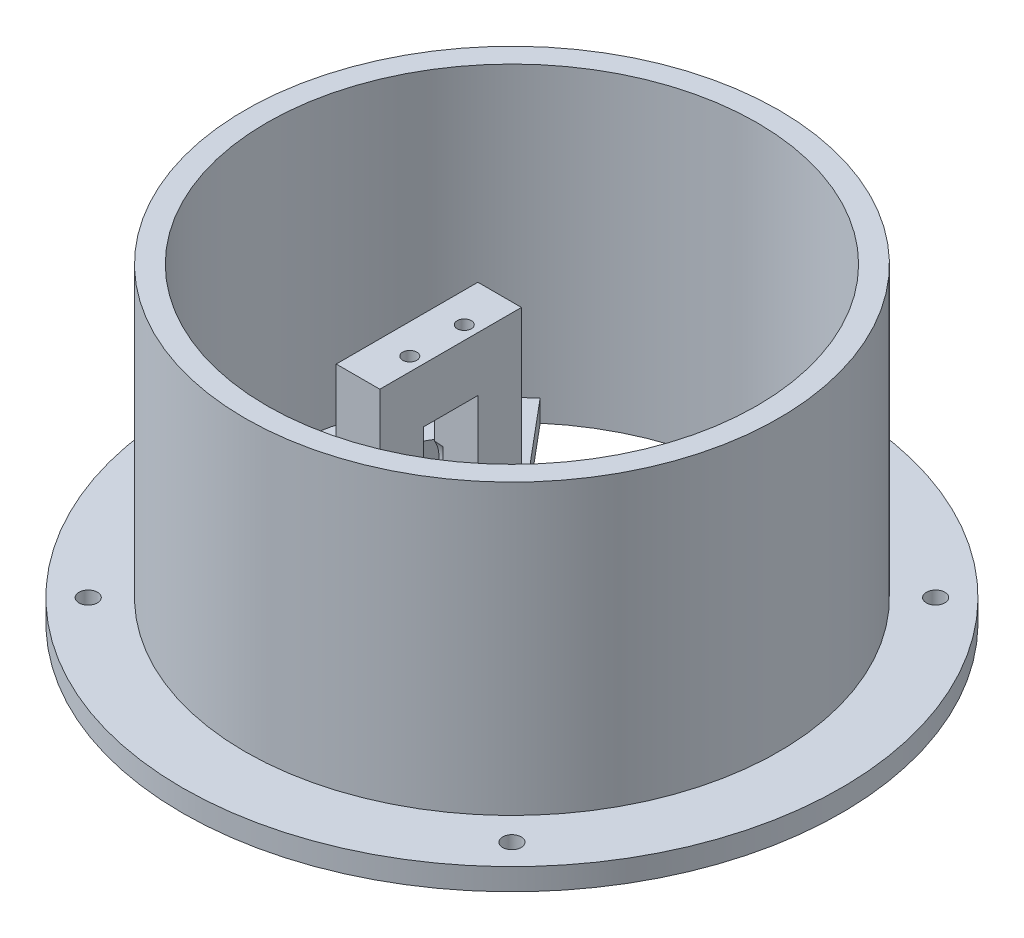
ISO-10303-21;
HEADER;
FILE_DESCRIPTION(('STEP AP214'),'2;1');
FILE_NAME('part.step','',(''),(''),'','','');
FILE_SCHEMA(('AUTOMOTIVE_DESIGN { 1 0 10303 214 1 1 1 1 }'));
ENDSEC;
DATA;
#1=APPLICATION_CONTEXT('core data for automotive mechanical design processes');
#2=APPLICATION_PROTOCOL_DEFINITION('international standard','automotive_design',2000,#1);
#3=PRODUCT_CONTEXT('',#1,'mechanical');
#4=PRODUCT('Part','Part','',(#3));
#5=PRODUCT_RELATED_PRODUCT_CATEGORY('part','',(#4));
#6=PRODUCT_DEFINITION_FORMATION('','',#4);
#7=PRODUCT_DEFINITION_CONTEXT('part definition',#1,'design');
#8=PRODUCT_DEFINITION('design','',#6,#7);
#9=PRODUCT_DEFINITION_SHAPE('','',#8);
#10=(LENGTH_UNIT() NAMED_UNIT(*) SI_UNIT(.MILLI.,.METRE.));
#11=(NAMED_UNIT(*) PLANE_ANGLE_UNIT() SI_UNIT($,.RADIAN.));
#12=(NAMED_UNIT(*) SI_UNIT($,.STERADIAN.) SOLID_ANGLE_UNIT());
#13=UNCERTAINTY_MEASURE_WITH_UNIT(LENGTH_MEASURE(1.E-05),#10,'distance_accuracy_value','');
#14=(GEOMETRIC_REPRESENTATION_CONTEXT(3) GLOBAL_UNCERTAINTY_ASSIGNED_CONTEXT((#13)) GLOBAL_UNIT_ASSIGNED_CONTEXT((#10,
#11,#12)) REPRESENTATION_CONTEXT('',''));
#15=CARTESIAN_POINT('',(0.,0.,0.));
#16=DIRECTION('',(0.,0.,1.));
#17=DIRECTION('',(1.,0.,0.));
#18=AXIS2_PLACEMENT_3D('',#15,#16,#17);
#19=CARTESIAN_POINT('',(-11.25,28.,-5.));
#20=DIRECTION('',(0.,0.,-1.));
#21=DIRECTION('',(-1.,0.,0.));
#22=AXIS2_PLACEMENT_3D('',#19,#20,#21);
#23=PLANE('',#22);
#24=CARTESIAN_POINT('',(-114.275588095662,14.,-4.99999999999998));
#25=DIRECTION('',(0.,0.,-1.));
#26=DIRECTION('',(-1.,0.,0.));
#27=AXIS2_PLACEMENT_3D('',#24,#25,#26);
#28=ELLIPSE('',#27,114.384920486063,5.);
#29=CARTESIAN_POINT('',(-19.25,11.2167920661692,-5.));
#30=VERTEX_POINT('',#29);
#31=CARTESIAN_POINT('',(-17.6520119744405,11.323981455856,-5.));
#32=VERTEX_POINT('',#31);
#33=EDGE_CURVE('E11',#30,#32,#28,.F.);
#34=ORIENTED_EDGE('',*,*,#33,.F.);
#35=DIRECTION('',(0.,-1.,0.));
#36=VECTOR('',#35,1.);
#37=CARTESIAN_POINT('',(-19.25,28.,-5.));
#38=LINE('',#37,#36);
#39=CARTESIAN_POINT('',(-19.25,5.,-4.99999999999999));
#40=VERTEX_POINT('',#39);
#41=EDGE_CURVE('E210',#30,#40,#38,.T.);
#42=ORIENTED_EDGE('',*,*,#41,.T.);
#43=DIRECTION('',(1.,0.,0.));
#44=VECTOR('',#43,1.);
#45=CARTESIAN_POINT('',(-11.25,5.,-5.));
#46=LINE('',#45,#44);
#47=CARTESIAN_POINT('',(-11.25,5.,-5.));
#48=VERTEX_POINT('',#47);
#49=EDGE_CURVE('E569',#40,#48,#46,.T.);
#50=ORIENTED_EDGE('',*,*,#49,.T.);
#51=DIRECTION('',(0.,-1.,0.));
#52=VECTOR('',#51,1.);
#53=CARTESIAN_POINT('',(-11.25,28.,-5.));
#54=LINE('',#53,#52);
#55=CARTESIAN_POINT('',(-11.25,28.,-5.));
#56=VERTEX_POINT('',#55);
#57=EDGE_CURVE('E215',#56,#48,#54,.T.);
#58=ORIENTED_EDGE('',*,*,#57,.F.);
#59=DIRECTION('',(1.,0.,0.));
#60=VECTOR('',#59,1.);
#61=CARTESIAN_POINT('',(-11.25,28.,-5.));
#62=LINE('',#61,#60);
#63=CARTESIAN_POINT('',(-19.25,28.,-5.));
#64=VERTEX_POINT('',#63);
#65=EDGE_CURVE('E205',#64,#56,#62,.T.);
#66=ORIENTED_EDGE('',*,*,#65,.F.);
#67=CARTESIAN_POINT('',(-19.25,16.7832079338308,-5.));
#68=VERTEX_POINT('',#67);
#69=EDGE_CURVE('E203',#64,#68,#38,.T.);
#70=ORIENTED_EDGE('',*,*,#69,.T.);
#71=CARTESIAN_POINT('',(-17.6520119744405,16.676018544144,-5.));
#72=VERTEX_POINT('',#71);
#73=EDGE_CURVE('E46',#72,#68,#28,.F.);
#74=ORIENTED_EDGE('',*,*,#73,.F.);
#75=DIRECTION('',(0.,-1.,0.));
#76=VECTOR('',#75,1.);
#77=CARTESIAN_POINT('',(-17.6520119744405,28.,-5.));
#78=LINE('',#77,#76);
#79=EDGE_CURVE('E190',#72,#32,#78,.T.);
#80=ORIENTED_EDGE('',*,*,#79,.T.);
#81=EDGE_LOOP('',(#34,#42,#50,#58,#66,#70,#74,#80));
#82=FACE_BOUND('',#81,.T.);
#83=ADVANCED_FACE('F42',(#82),#23,.F.);
#84=CARTESIAN_POINT('',(34.25,28.,5.));
#85=DIRECTION('',(0.,1.,0.));
#86=DIRECTION('',(0.,0.,1.));
#87=AXIS2_PLACEMENT_3D('',#84,#85,#86);
#88=CYLINDRICAL_SURFACE('',#87,1.3);
#89=CARTESIAN_POINT('',(34.25,38.,5.));
#90=DIRECTION('',(0.,1.,0.));
#91=DIRECTION('',(0.,0.,1.));
#92=AXIS2_PLACEMENT_3D('',#89,#90,#91);
#93=CIRCLE('',#92,1.3);
#94=CARTESIAN_POINT('',(34.25,38.,6.3));
#95=VERTEX_POINT('',#94);
#96=EDGE_CURVE('E590',#95,#95,#93,.T.);
#97=ORIENTED_EDGE('',*,*,#96,.T.);
#98=EDGE_LOOP('',(#97));
#99=FACE_BOUND('',#98,.T.);
#100=CARTESIAN_POINT('',(34.25,33.,5.));
#101=DIRECTION('',(0.,-1.,0.));
#102=DIRECTION('',(0.,0.,-1.));
#103=AXIS2_PLACEMENT_3D('',#100,#101,#102);
#104=CIRCLE('',#103,1.3);
#105=CARTESIAN_POINT('',(34.25,33.,3.69999999999999));
#106=VERTEX_POINT('',#105);
#107=EDGE_CURVE('E195',#106,#106,#104,.F.);
#108=ORIENTED_EDGE('',*,*,#107,.F.);
#109=EDGE_LOOP('',(#108));
#110=FACE_BOUND('',#109,.T.);
#111=ADVANCED_FACE('F352',(#99,#110),#88,.F.);
#112=CARTESIAN_POINT('',(34.25,28.,-5.));
#113=DIRECTION('',(0.,1.,0.));
#114=DIRECTION('',(0.,0.,1.));
#115=AXIS2_PLACEMENT_3D('',#112,#113,#114);
#116=CYLINDRICAL_SURFACE('',#115,1.3);
#117=CARTESIAN_POINT('',(34.25,38.,-5.));
#118=DIRECTION('',(0.,1.,0.));
#119=DIRECTION('',(0.,0.,1.));
#120=AXIS2_PLACEMENT_3D('',#117,#118,#119);
#121=CIRCLE('',#120,1.3);
#122=CARTESIAN_POINT('',(34.25,38.,-3.7));
#123=VERTEX_POINT('',#122);
#124=EDGE_CURVE('E592',#123,#123,#121,.T.);
#125=ORIENTED_EDGE('',*,*,#124,.T.);
#126=EDGE_LOOP('',(#125));
#127=FACE_BOUND('',#126,.T.);
#128=CARTESIAN_POINT('',(34.25,33.,-5.));
#129=DIRECTION('',(0.,-1.,0.));
#130=DIRECTION('',(0.,0.,-1.));
#131=AXIS2_PLACEMENT_3D('',#128,#129,#130);
#132=CIRCLE('',#131,1.3);
#133=CARTESIAN_POINT('',(34.25,33.,-6.30000000000001));
#134=VERTEX_POINT('',#133);
#135=EDGE_CURVE('E344',#134,#134,#132,.F.);
#136=ORIENTED_EDGE('',*,*,#135,.F.);
#137=EDGE_LOOP('',(#136));
#138=FACE_BOUND('',#137,.T.);
#139=ADVANCED_FACE('F354',(#127,#138),#116,.F.);
#140=CARTESIAN_POINT('',(0.,4.,0.));
#141=DIRECTION('',(0.,-1.,0.));
#142=DIRECTION('',(0.,0.,-1.));
#143=AXIS2_PLACEMENT_3D('',#140,#141,#142);
#144=CYLINDRICAL_SURFACE('',#143,45.);
#145=CARTESIAN_POINT('',(0.,70.0295309680047,0.));
#146=DIRECTION('',(0.797918872779386,0.602764856691623,0.));
#147=DIRECTION('',(0.602764856691623,-0.797918872779387,0.));
#148=AXIS2_PLACEMENT_3D('',#145,#146,#147);
#149=ELLIPSE('',#148,74.6559781985136,45.);
#150=CARTESIAN_POINT('',(43.081318457076,13.,-13.));
#151=VERTEX_POINT('',#150);
#152=CARTESIAN_POINT('',(43.081318457076,13.,13.));
#153=VERTEX_POINT('',#152);
#154=EDGE_CURVE('E586',#151,#153,#149,.F.);
#155=ORIENTED_EDGE('',*,*,#154,.F.);
#156=DIRECTION('',(0.,-1.,0.));
#157=VECTOR('',#156,1.);
#158=CARTESIAN_POINT('',(43.081318457076,4.,-13.));
#159=LINE('',#158,#157);
#160=CARTESIAN_POINT('',(43.081318457076,0.,-13.));
#161=VERTEX_POINT('',#160);
#162=EDGE_CURVE('E63',#161,#151,#159,.F.);
#163=ORIENTED_EDGE('',*,*,#162,.F.);
#164=CARTESIAN_POINT('',(0.,0.,0.));
#165=DIRECTION('',(0.,1.,0.));
#166=DIRECTION('',(0.,0.,1.));
#167=AXIS2_PLACEMENT_3D('',#164,#165,#166);
#168=CIRCLE('',#167,45.);
#169=CARTESIAN_POINT('',(43.081318457076,0.,13.));
#170=VERTEX_POINT('',#169);
#171=EDGE_CURVE('E314',#170,#161,#168,.T.);
#172=ORIENTED_EDGE('',*,*,#171,.F.);
#173=DIRECTION('',(0.,-1.,0.));
#174=VECTOR('',#173,1.);
#175=CARTESIAN_POINT('',(43.081318457076,4.,13.));
#176=LINE('',#175,#174);
#177=EDGE_CURVE('E248',#153,#170,#176,.T.);
#178=ORIENTED_EDGE('',*,*,#177,.F.);
#179=EDGE_LOOP('',(#155,#163,#172,#178));
#180=FACE_BOUND('',#179,.T.);
#181=ADVANCED_FACE('F361',(#180),#144,.F.);
#182=CARTESIAN_POINT('',(0.,5.,0.));
#183=DIRECTION('',(0.,-1.,0.));
#184=DIRECTION('',(0.,0.,-1.));
#185=AXIS2_PLACEMENT_3D('',#182,#183,#184);
#186=PLANE('',#185);
#187=DIRECTION('',(-1.,0.,0.));
#188=VECTOR('',#187,1.);
#189=CARTESIAN_POINT('',(-19.25,5.,5.));
#190=LINE('',#189,#188);
#191=CARTESIAN_POINT('',(-11.25,5.,5.));
#192=VERTEX_POINT('',#191);
#193=CARTESIAN_POINT('',(-19.25,5.,5.));
#194=VERTEX_POINT('',#193);
#195=EDGE_CURVE('E555',#192,#194,#190,.T.);
#196=ORIENTED_EDGE('',*,*,#195,.F.);
#197=DIRECTION('',(0.,0.,-1.));
#198=VECTOR('',#197,1.);
#199=CARTESIAN_POINT('',(-11.25,5.,-13.));
#200=LINE('',#199,#198);
#201=EDGE_CURVE('E221',#192,#48,#200,.T.);
#202=ORIENTED_EDGE('',*,*,#201,.T.);
#203=ORIENTED_EDGE('',*,*,#49,.F.);
#204=DIRECTION('',(0.,0.,1.));
#205=VECTOR('',#204,1.);
#206=CARTESIAN_POINT('',(-19.25,5.,13.));
#207=LINE('',#206,#205);
#208=EDGE_CURVE('E219',#40,#194,#207,.T.);
#209=ORIENTED_EDGE('',*,*,#208,.T.);
#210=EDGE_LOOP('',(#196,#202,#203,#209));
#211=FACE_BOUND('',#210,.T.);
#212=ADVANCED_FACE('F415',(#211),#186,.F.);
#213=CARTESIAN_POINT('',(0.,4.,0.));
#214=DIRECTION('',(0.,1.,0.));
#215=DIRECTION('',(0.,0.,1.));
#216=AXIS2_PLACEMENT_3D('',#213,#214,#215);
#217=PLANE('',#216);
#218=DIRECTION('',(0.,0.,-1.));
#219=VECTOR('',#218,1.);
#220=CARTESIAN_POINT('',(-24.25,4.,-16.));
#221=LINE('',#220,#219);
#222=CARTESIAN_POINT('',(-24.25,4.,16.));
#223=VERTEX_POINT('',#222);
#224=CARTESIAN_POINT('',(-24.25,4.,-16.));
#225=VERTEX_POINT('',#224);
#226=EDGE_CURVE('E270',#223,#225,#221,.T.);
#227=ORIENTED_EDGE('',*,*,#226,.F.);
#228=DIRECTION('',(0.64278760968654,0.,-0.766044443118977));
#229=VECTOR('',#228,1.);
#230=CARTESIAN_POINT('',(-24.25,4.,16.));
#231=LINE('',#230,#229);
#232=CARTESIAN_POINT('',(-29.5302261524042,4.,22.2927284868376));
#233=VERTEX_POINT('',#232);
#234=EDGE_CURVE('E268',#233,#223,#231,.T.);
#235=ORIENTED_EDGE('',*,*,#234,.F.);
#236=CARTESIAN_POINT('',(0.,4.,0.));
#237=DIRECTION('',(0.,1.,0.));
#238=DIRECTION('',(0.,0.,1.));
#239=AXIS2_PLACEMENT_3D('',#236,#237,#238);
#240=CIRCLE('',#239,37.);
#241=CARTESIAN_POINT('',(-29.5302261524042,4.,-22.2927284868377));
#242=VERTEX_POINT('',#241);
#243=EDGE_CURVE('E276',#242,#233,#240,.T.);
#244=ORIENTED_EDGE('',*,*,#243,.F.);
#245=DIRECTION('',(-0.642787609686536,0.,-0.766044443118981));
#246=VECTOR('',#245,1.);
#247=CARTESIAN_POINT('',(-24.25,4.,-16.));
#248=LINE('',#247,#246);
#249=EDGE_CURVE('E273',#225,#242,#248,.T.);
#250=ORIENTED_EDGE('',*,*,#249,.F.);
#251=EDGE_LOOP('',(#227,#235,#244,#250));
#252=FACE_BOUND('',#251,.T.);
#253=DIRECTION('',(0.,0.,1.));
#254=VECTOR('',#253,1.);
#255=CARTESIAN_POINT('',(-19.25,4.,13.));
#256=LINE('',#255,#254);
#257=CARTESIAN_POINT('',(-19.25,4.,-13.));
#258=VERTEX_POINT('',#257);
#259=CARTESIAN_POINT('',(-19.25,4.,13.));
#260=VERTEX_POINT('',#259);
#261=EDGE_CURVE('E213',#258,#260,#256,.T.);
#262=ORIENTED_EDGE('',*,*,#261,.F.);
#263=DIRECTION('',(-1.,0.,0.));
#264=VECTOR('',#263,1.);
#265=CARTESIAN_POINT('',(-19.25,4.,-13.));
#266=LINE('',#265,#264);
#267=CARTESIAN_POINT('',(-11.25,4.,-13.));
#268=VERTEX_POINT('',#267);
#269=EDGE_CURVE('E209',#268,#258,#266,.T.);
#270=ORIENTED_EDGE('',*,*,#269,.F.);
#271=DIRECTION('',(0.642787609686535,0.,0.766044443118982));
#272=VECTOR('',#271,1.);
#273=CARTESIAN_POINT('',(-11.25,4.,-13.));
#274=LINE('',#273,#272);
#275=CARTESIAN_POINT('',(-29.1254736691165,4.,-34.3031599644931));
#276=VERTEX_POINT('',#275);
#277=EDGE_CURVE('E302',#276,#268,#274,.T.);
#278=ORIENTED_EDGE('',*,*,#277,.F.);
#279=CARTESIAN_POINT('',(0.,4.,0.));
#280=DIRECTION('',(0.,1.,0.));
#281=DIRECTION('',(0.,0.,1.));
#282=AXIS2_PLACEMENT_3D('',#279,#280,#281);
#283=CIRCLE('',#282,45.);
#284=CARTESIAN_POINT('',(-29.1254736691167,4.,34.3031599644929));
#285=VERTEX_POINT('',#284);
#286=EDGE_CURVE('E236',#276,#285,#283,.T.);
#287=ORIENTED_EDGE('',*,*,#286,.T.);
#288=DIRECTION('',(-0.642787609686541,0.,0.766044443118977));
#289=VECTOR('',#288,1.);
#290=CARTESIAN_POINT('',(-11.25,4.,13.));
#291=LINE('',#290,#289);
#292=CARTESIAN_POINT('',(-11.25,4.,13.));
#293=VERTEX_POINT('',#292);
#294=EDGE_CURVE('E299',#293,#285,#291,.T.);
#295=ORIENTED_EDGE('',*,*,#294,.F.);
#296=DIRECTION('',(1.,0.,0.));
#297=VECTOR('',#296,1.);
#298=CARTESIAN_POINT('',(-11.25,4.,13.));
#299=LINE('',#298,#297);
#300=EDGE_CURVE('E222',#260,#293,#299,.T.);
#301=ORIENTED_EDGE('',*,*,#300,.F.);
#302=EDGE_LOOP('',(#262,#270,#278,#287,#295,#301));
#303=FACE_BOUND('',#302,.T.);
#304=ADVANCED_FACE('F418',(#252,#303),#217,.T.);
#305=CARTESIAN_POINT('',(0.,4.,0.));
#306=DIRECTION('',(0.,1.,0.));
#307=DIRECTION('',(0.,0.,1.));
#308=AXIS2_PLACEMENT_3D('',#305,#306,#307);
#309=CIRCLE('',#308,60.5);
#310=CARTESIAN_POINT('',(0.,4.,60.5));
#311=VERTEX_POINT('',#310);
#312=EDGE_CURVE('E249',#311,#311,#309,.T.);
#313=ORIENTED_EDGE('',*,*,#312,.T.);
#314=EDGE_LOOP('',(#313));
#315=FACE_BOUND('',#314,.T.);
#316=CARTESIAN_POINT('',(0.,4.,0.));
#317=DIRECTION('',(0.,1.,0.));
#318=DIRECTION('',(0.,0.,1.));
#319=AXIS2_PLACEMENT_3D('',#316,#317,#318);
#320=CIRCLE('',#319,49.);
#321=CARTESIAN_POINT('',(0.,4.,49.));
#322=VERTEX_POINT('',#321);
#323=EDGE_CURVE('E245',#322,#322,#320,.T.);
#324=ORIENTED_EDGE('',*,*,#323,.F.);
#325=EDGE_LOOP('',(#324));
#326=FACE_BOUND('',#325,.T.);
#327=CARTESIAN_POINT('',(38.89087296526,4.,-38.8908729652602));
#328=DIRECTION('',(0.,1.,0.));
#329=DIRECTION('',(0.,0.,1.));
#330=AXIS2_PLACEMENT_3D('',#327,#328,#329);
#331=CIRCLE('',#330,1.70000000000001);
#332=CARTESIAN_POINT('',(38.89087296526,4.,-37.1908729652602));
#333=VERTEX_POINT('',#332);
#334=EDGE_CURVE('E256',#333,#333,#331,.T.);
#335=ORIENTED_EDGE('',*,*,#334,.F.);
#336=EDGE_LOOP('',(#335));
#337=FACE_BOUND('',#336,.T.);
#338=CARTESIAN_POINT('',(-38.89087296526,4.,38.8908729652602));
#339=DIRECTION('',(0.,1.,0.));
#340=DIRECTION('',(0.,0.,1.));
#341=AXIS2_PLACEMENT_3D('',#338,#339,#340);
#342=CIRCLE('',#341,1.7);
#343=CARTESIAN_POINT('',(-38.89087296526,4.,40.5908729652602));
#344=VERTEX_POINT('',#343);
#345=EDGE_CURVE('E330',#344,#344,#342,.T.);
#346=ORIENTED_EDGE('',*,*,#345,.F.);
#347=EDGE_LOOP('',(#346));
#348=FACE_BOUND('',#347,.T.);
#349=CARTESIAN_POINT('',(-38.8908729652602,4.,-38.89087296526));
#350=DIRECTION('',(0.,1.,0.));
#351=DIRECTION('',(0.,0.,1.));
#352=AXIS2_PLACEMENT_3D('',#349,#350,#351);
#353=CIRCLE('',#352,1.7);
#354=CARTESIAN_POINT('',(-38.8908729652602,4.,-37.19087296526));
#355=VERTEX_POINT('',#354);
#356=EDGE_CURVE('E262',#355,#355,#353,.T.);
#357=ORIENTED_EDGE('',*,*,#356,.F.);
#358=EDGE_LOOP('',(#357));
#359=FACE_BOUND('',#358,.T.);
#360=CARTESIAN_POINT('',(38.8908729652602,4.,38.89087296526));
#361=DIRECTION('',(0.,1.,0.));
#362=DIRECTION('',(0.,0.,1.));
#363=AXIS2_PLACEMENT_3D('',#360,#361,#362);
#364=CIRCLE('',#363,1.69999999999999);
#365=CARTESIAN_POINT('',(38.8908729652602,4.,40.59087296526));
#366=VERTEX_POINT('',#365);
#367=EDGE_CURVE('E250',#366,#366,#364,.T.);
#368=ORIENTED_EDGE('',*,*,#367,.F.);
#369=EDGE_LOOP('',(#368));
#370=FACE_BOUND('',#369,.T.);
#371=ADVANCED_FACE('F486',(#315,#326,#337,#348,#359,#370),#217,.T.);
#372=CARTESIAN_POINT('',(0.,0.,0.));
#373=DIRECTION('',(0.,1.,0.));
#374=DIRECTION('',(0.,0.,1.));
#375=AXIS2_PLACEMENT_3D('',#372,#373,#374);
#376=PLANE('',#375);
#377=DIRECTION('',(-0.642787609686541,0.,0.766044443118977));
#378=VECTOR('',#377,1.);
#379=CARTESIAN_POINT('',(-11.25,0.,13.));
#380=LINE('',#379,#378);
#381=CARTESIAN_POINT('',(-11.25,0.,13.));
#382=VERTEX_POINT('',#381);
#383=CARTESIAN_POINT('',(-29.1254736691167,0.,34.3031599644929));
#384=VERTEX_POINT('',#383);
#385=EDGE_CURVE('E298',#382,#384,#380,.T.);
#386=ORIENTED_EDGE('',*,*,#385,.T.);
#387=EDGE_CURVE('E310',#384,#170,#168,.T.);
#388=ORIENTED_EDGE('',*,*,#387,.T.);
#389=ORIENTED_EDGE('',*,*,#171,.T.);
#390=CARTESIAN_POINT('',(-29.1254736691165,0.,-34.3031599644931));
#391=VERTEX_POINT('',#390);
#392=EDGE_CURVE('E309',#161,#391,#168,.T.);
#393=ORIENTED_EDGE('',*,*,#392,.T.);
#394=DIRECTION('',(0.642787609686535,0.,0.766044443118982));
#395=VECTOR('',#394,1.);
#396=CARTESIAN_POINT('',(-11.25,0.,-13.));
#397=LINE('',#396,#395);
#398=CARTESIAN_POINT('',(-11.25,0.,-13.));
#399=VERTEX_POINT('',#398);
#400=EDGE_CURVE('E313',#391,#399,#397,.T.);
#401=ORIENTED_EDGE('',*,*,#400,.T.);
#402=DIRECTION('',(0.,0.,1.));
#403=VECTOR('',#402,1.);
#404=CARTESIAN_POINT('',(-11.25,0.,-13.));
#405=LINE('',#404,#403);
#406=EDGE_CURVE('E303',#399,#382,#405,.T.);
#407=ORIENTED_EDGE('',*,*,#406,.T.);
#408=EDGE_LOOP('',(#386,#388,#389,#393,#401,#407));
#409=FACE_BOUND('',#408,.T.);
#410=CARTESIAN_POINT('',(0.,0.,0.));
#411=DIRECTION('',(0.,1.,0.));
#412=DIRECTION('',(0.,0.,1.));
#413=AXIS2_PLACEMENT_3D('',#410,#411,#412);
#414=CIRCLE('',#413,60.5);
#415=CARTESIAN_POINT('',(0.,0.,60.5));
#416=VERTEX_POINT('',#415);
#417=EDGE_CURVE('E333',#416,#416,#414,.T.);
#418=ORIENTED_EDGE('',*,*,#417,.F.);
#419=EDGE_LOOP('',(#418));
#420=FACE_BOUND('',#419,.T.);
#421=CARTESIAN_POINT('',(-38.89087296526,0.,38.8908729652602));
#422=DIRECTION('',(0.,1.,0.));
#423=DIRECTION('',(0.,0.,1.));
#424=AXIS2_PLACEMENT_3D('',#421,#422,#423);
#425=CIRCLE('',#424,1.7);
#426=CARTESIAN_POINT('',(-38.89087296526,0.,40.5908729652602));
#427=VERTEX_POINT('',#426);
#428=EDGE_CURVE('E329',#427,#427,#425,.T.);
#429=ORIENTED_EDGE('',*,*,#428,.T.);
#430=EDGE_LOOP('',(#429));
#431=FACE_BOUND('',#430,.T.);
#432=DIRECTION('',(0.64278760968654,0.,-0.766044443118977));
#433=VECTOR('',#432,1.);
#434=CARTESIAN_POINT('',(-24.25,0.,16.));
#435=LINE('',#434,#433);
#436=CARTESIAN_POINT('',(-29.5302261524042,0.,22.2927284868376));
#437=VERTEX_POINT('',#436);
#438=CARTESIAN_POINT('',(-24.25,0.,16.));
#439=VERTEX_POINT('',#438);
#440=EDGE_CURVE('E265',#437,#439,#435,.T.);
#441=ORIENTED_EDGE('',*,*,#440,.T.);
#442=DIRECTION('',(0.,0.,-1.));
#443=VECTOR('',#442,1.);
#444=CARTESIAN_POINT('',(-24.25,0.,-16.));
#445=LINE('',#444,#443);
#446=CARTESIAN_POINT('',(-24.25,0.,-16.));
#447=VERTEX_POINT('',#446);
#448=EDGE_CURVE('E281',#439,#447,#445,.T.);
#449=ORIENTED_EDGE('',*,*,#448,.T.);
#450=DIRECTION('',(-0.642787609686536,0.,-0.766044443118981));
#451=VECTOR('',#450,1.);
#452=CARTESIAN_POINT('',(-24.25,0.,-16.));
#453=LINE('',#452,#451);
#454=CARTESIAN_POINT('',(-29.5302261524042,0.,-22.2927284868377));
#455=VERTEX_POINT('',#454);
#456=EDGE_CURVE('E284',#447,#455,#453,.T.);
#457=ORIENTED_EDGE('',*,*,#456,.T.);
#458=CARTESIAN_POINT('',(0.,0.,0.));
#459=DIRECTION('',(0.,1.,0.));
#460=DIRECTION('',(0.,0.,1.));
#461=AXIS2_PLACEMENT_3D('',#458,#459,#460);
#462=CIRCLE('',#461,37.);
#463=EDGE_CURVE('E271',#455,#437,#462,.T.);
#464=ORIENTED_EDGE('',*,*,#463,.T.);
#465=EDGE_LOOP('',(#441,#449,#457,#464));
#466=FACE_BOUND('',#465,.T.);
#467=CARTESIAN_POINT('',(-38.8908729652602,0.,-38.89087296526));
#468=DIRECTION('',(0.,1.,0.));
#469=DIRECTION('',(0.,0.,1.));
#470=AXIS2_PLACEMENT_3D('',#467,#468,#469);
#471=CIRCLE('',#470,1.7);
#472=CARTESIAN_POINT('',(-38.8908729652602,0.,-37.19087296526));
#473=VERTEX_POINT('',#472);
#474=EDGE_CURVE('E259',#473,#473,#471,.T.);
#475=ORIENTED_EDGE('',*,*,#474,.T.);
#476=EDGE_LOOP('',(#475));
#477=FACE_BOUND('',#476,.T.);
#478=CARTESIAN_POINT('',(38.89087296526,0.,-38.8908729652602));
#479=DIRECTION('',(0.,1.,0.));
#480=DIRECTION('',(0.,0.,1.));
#481=AXIS2_PLACEMENT_3D('',#478,#479,#480);
#482=CIRCLE('',#481,1.70000000000001);
#483=CARTESIAN_POINT('',(38.89087296526,0.,-37.1908729652602));
#484=VERTEX_POINT('',#483);
#485=EDGE_CURVE('E253',#484,#484,#482,.T.);
#486=ORIENTED_EDGE('',*,*,#485,.T.);
#487=EDGE_LOOP('',(#486));
#488=FACE_BOUND('',#487,.T.);
#489=CARTESIAN_POINT('',(38.8908729652602,0.,38.89087296526));
#490=DIRECTION('',(0.,1.,0.));
#491=DIRECTION('',(0.,0.,1.));
#492=AXIS2_PLACEMENT_3D('',#489,#490,#491);
#493=CIRCLE('',#492,1.69999999999999);
#494=CARTESIAN_POINT('',(38.8908729652602,0.,40.59087296526));
#495=VERTEX_POINT('',#494);
#496=EDGE_CURVE('E244',#495,#495,#493,.T.);
#497=ORIENTED_EDGE('',*,*,#496,.T.);
#498=EDGE_LOOP('',(#497));
#499=FACE_BOUND('',#498,.T.);
#500=ADVANCED_FACE('F488',(#409,#420,#431,#466,#477,#488,#499),#376,.F.);
#501=CARTESIAN_POINT('',(0.,4.,0.));
#502=DIRECTION('',(0.,-1.,0.));
#503=DIRECTION('',(0.,0.,-1.));
#504=AXIS2_PLACEMENT_3D('',#501,#502,#503);
#505=CYLINDRICAL_SURFACE('',#504,60.5);
#506=ORIENTED_EDGE('',*,*,#417,.T.);
#507=EDGE_LOOP('',(#506));
#508=FACE_BOUND('',#507,.T.);
#509=ORIENTED_EDGE('',*,*,#312,.F.);
#510=EDGE_LOOP('',(#509));
#511=FACE_BOUND('',#510,.T.);
#512=ADVANCED_FACE('F44',(#508,#511),#505,.T.);
#513=CARTESIAN_POINT('',(-38.89087296526,4.,38.8908729652602));
#514=DIRECTION('',(0.,-1.,0.));
#515=DIRECTION('',(0.,0.,-1.));
#516=AXIS2_PLACEMENT_3D('',#513,#514,#515);
#517=CYLINDRICAL_SURFACE('',#516,1.7);
#518=ORIENTED_EDGE('',*,*,#345,.T.);
#519=EDGE_LOOP('',(#518));
#520=FACE_BOUND('',#519,.T.);
#521=ORIENTED_EDGE('',*,*,#428,.F.);
#522=EDGE_LOOP('',(#521));
#523=FACE_BOUND('',#522,.T.);
#524=ADVANCED_FACE('F481',(#520,#523),#517,.F.);
#525=CARTESIAN_POINT('',(-11.25,4.,13.));
#526=DIRECTION('',(0.766044443118977,0.,0.64278760968654));
#527=DIRECTION('',(0.64278760968654,0.,-0.766044443118977));
#528=AXIS2_PLACEMENT_3D('',#525,#526,#527);
#529=PLANE('',#528);
#530=ORIENTED_EDGE('',*,*,#385,.F.);
#531=DIRECTION('',(0.,-1.,0.));
#532=VECTOR('',#531,1.);
#533=CARTESIAN_POINT('',(-11.25,4.,13.));
#534=LINE('',#533,#532);
#535=EDGE_CURVE('E306',#293,#382,#534,.T.);
#536=ORIENTED_EDGE('',*,*,#535,.F.);
#537=ORIENTED_EDGE('',*,*,#294,.T.);
#538=DIRECTION('',(0.,-1.,0.));
#539=VECTOR('',#538,1.);
#540=CARTESIAN_POINT('',(-29.1254736691167,4.,34.3031599644929));
#541=LINE('',#540,#539);
#542=EDGE_CURVE('E326',#285,#384,#541,.T.);
#543=ORIENTED_EDGE('',*,*,#542,.T.);
#544=EDGE_LOOP('',(#530,#536,#537,#543));
#545=FACE_BOUND('',#544,.T.);
#546=ADVANCED_FACE('F477',(#545),#529,.T.);
#547=CARTESIAN_POINT('',(0.,57.,0.));
#548=DIRECTION('',(0.,1.,0.));
#549=DIRECTION('',(0.,0.,1.));
#550=AXIS2_PLACEMENT_3D('',#547,#548,#549);
#551=CIRCLE('',#550,45.);
#552=CARTESIAN_POINT('',(0.,57.,45.));
#553=VERTEX_POINT('',#552);
#554=EDGE_CURVE('E237',#553,#553,#551,.T.);
#555=ORIENTED_EDGE('',*,*,#554,.T.);
#556=EDGE_LOOP('',(#555));
#557=FACE_BOUND('',#556,.T.);
#558=DIRECTION('',(0.,-1.,0.));
#559=VECTOR('',#558,1.);
#560=CARTESIAN_POINT('',(43.081318457076,4.,-13.));
#561=LINE('',#560,#559);
#562=CARTESIAN_POINT('',(43.081318457076,38.,-13.));
#563=VERTEX_POINT('',#562);
#564=EDGE_CURVE('E617',#563,#151,#561,.T.);
#565=ORIENTED_EDGE('',*,*,#564,.F.);
#566=CARTESIAN_POINT('',(0.,38.,0.));
#567=DIRECTION('',(0.,-1.,0.));
#568=DIRECTION('',(0.,0.,-1.));
#569=AXIS2_PLACEMENT_3D('',#566,#567,#568);
#570=CIRCLE('',#569,45.);
#571=CARTESIAN_POINT('',(43.081318457076,38.,13.));
#572=VERTEX_POINT('',#571);
#573=EDGE_CURVE('E608',#563,#572,#570,.T.);
#574=ORIENTED_EDGE('',*,*,#573,.T.);
#575=DIRECTION('',(0.,-1.,0.));
#576=VECTOR('',#575,1.);
#577=CARTESIAN_POINT('',(43.081318457076,4.,13.));
#578=LINE('',#577,#576);
#579=EDGE_CURVE('E613',#153,#572,#578,.F.);
#580=ORIENTED_EDGE('',*,*,#579,.F.);
#581=ORIENTED_EDGE('',*,*,#177,.T.);
#582=ORIENTED_EDGE('',*,*,#387,.F.);
#583=ORIENTED_EDGE('',*,*,#542,.F.);
#584=ORIENTED_EDGE('',*,*,#286,.F.);
#585=DIRECTION('',(0.,-1.,0.));
#586=VECTOR('',#585,1.);
#587=CARTESIAN_POINT('',(-29.1254736691165,4.,-34.3031599644931));
#588=LINE('',#587,#586);
#589=EDGE_CURVE('E323',#276,#391,#588,.T.);
#590=ORIENTED_EDGE('',*,*,#589,.T.);
#591=ORIENTED_EDGE('',*,*,#392,.F.);
#592=ORIENTED_EDGE('',*,*,#162,.T.);
#593=EDGE_LOOP('',(#565,#574,#580,#581,#582,#583,#584,#590,#591,#592));
#594=FACE_BOUND('',#593,.T.);
#595=ADVANCED_FACE('F473',(#557,#594),#144,.F.);
#596=CARTESIAN_POINT('',(-11.25,4.,-13.));
#597=DIRECTION('',(0.766044443118982,0.,-0.642787609686535));
#598=DIRECTION('',(-0.642787609686535,0.,-0.766044443118982));
#599=AXIS2_PLACEMENT_3D('',#596,#597,#598);
#600=PLANE('',#599);
#601=ORIENTED_EDGE('',*,*,#400,.F.);
#602=ORIENTED_EDGE('',*,*,#589,.F.);
#603=ORIENTED_EDGE('',*,*,#277,.T.);
#604=DIRECTION('',(0.,-1.,0.));
#605=VECTOR('',#604,1.);
#606=CARTESIAN_POINT('',(-11.25,4.,-13.));
#607=LINE('',#606,#605);
#608=EDGE_CURVE('E321',#268,#399,#607,.T.);
#609=ORIENTED_EDGE('',*,*,#608,.T.);
#610=EDGE_LOOP('',(#601,#602,#603,#609));
#611=FACE_BOUND('',#610,.T.);
#612=ADVANCED_FACE('F469',(#611),#600,.T.);
#613=CARTESIAN_POINT('',(-11.25,4.,-13.));
#614=DIRECTION('',(1.,0.,0.));
#615=DIRECTION('',(0.,0.,-1.));
#616=AXIS2_PLACEMENT_3D('',#613,#614,#615);
#617=PLANE('',#616);
#618=DIRECTION('',(0.,-1.,0.));
#619=VECTOR('',#618,1.);
#620=CARTESIAN_POINT('',(-11.25,5.,-13.));
#621=LINE('',#620,#619);
#622=CARTESIAN_POINT('',(-11.25,38.,-13.));
#623=VERTEX_POINT('',#622);
#624=EDGE_CURVE('E223',#623,#268,#621,.T.);
#625=ORIENTED_EDGE('',*,*,#624,.F.);
#626=DIRECTION('',(0.,0.,-1.));
#627=VECTOR('',#626,1.);
#628=CARTESIAN_POINT('',(-11.25,38.,-13.));
#629=LINE('',#628,#627);
#630=CARTESIAN_POINT('',(-11.25,38.,13.));
#631=VERTEX_POINT('',#630);
#632=EDGE_CURVE('E538',#631,#623,#629,.T.);
#633=ORIENTED_EDGE('',*,*,#632,.F.);
#634=DIRECTION('',(0.,-1.,0.));
#635=VECTOR('',#634,1.);
#636=CARTESIAN_POINT('',(-11.25,5.,13.));
#637=LINE('',#636,#635);
#638=EDGE_CURVE('E229',#631,#293,#637,.T.);
#639=ORIENTED_EDGE('',*,*,#638,.T.);
#640=ORIENTED_EDGE('',*,*,#535,.T.);
#641=ORIENTED_EDGE('',*,*,#406,.F.);
#642=ORIENTED_EDGE('',*,*,#608,.F.);
#643=EDGE_LOOP('',(#625,#633,#639,#640,#641,#642));
#644=FACE_BOUND('',#643,.T.);
#645=DIRECTION('',(0.,0.,-1.));
#646=VECTOR('',#645,1.);
#647=CARTESIAN_POINT('',(-11.25,28.,-13.));
#648=LINE('',#647,#646);
#649=CARTESIAN_POINT('',(-11.25,28.,4.99999999999999));
#650=VERTEX_POINT('',#649);
#651=EDGE_CURVE('E544',#650,#56,#648,.T.);
#652=ORIENTED_EDGE('',*,*,#651,.T.);
#653=ORIENTED_EDGE('',*,*,#57,.T.);
#654=ORIENTED_EDGE('',*,*,#201,.F.);
#655=DIRECTION('',(0.,-1.,0.));
#656=VECTOR('',#655,1.);
#657=CARTESIAN_POINT('',(-11.25,28.,5.));
#658=LINE('',#657,#656);
#659=EDGE_CURVE('E566',#650,#192,#658,.T.);
#660=ORIENTED_EDGE('',*,*,#659,.F.);
#661=EDGE_LOOP('',(#652,#653,#654,#660));
#662=FACE_BOUND('',#661,.T.);
#663=ADVANCED_FACE('F465',(#644,#662),#617,.T.);
#664=CARTESIAN_POINT('',(-24.25,4.,16.));
#665=DIRECTION('',(-0.766044443118978,0.,-0.64278760968654));
#666=DIRECTION('',(-0.64278760968654,0.,0.766044443118977));
#667=AXIS2_PLACEMENT_3D('',#664,#665,#666);
#668=PLANE('',#667);
#669=ORIENTED_EDGE('',*,*,#440,.F.);
#670=DIRECTION('',(0.,-1.,0.));
#671=VECTOR('',#670,1.);
#672=CARTESIAN_POINT('',(-29.5302261524042,4.,22.2927284868376));
#673=LINE('',#672,#671);
#674=EDGE_CURVE('E278',#233,#437,#673,.T.);
#675=ORIENTED_EDGE('',*,*,#674,.F.);
#676=ORIENTED_EDGE('',*,*,#234,.T.);
#677=DIRECTION('',(0.,-1.,0.));
#678=VECTOR('',#677,1.);
#679=CARTESIAN_POINT('',(-24.25,4.,16.));
#680=LINE('',#679,#678);
#681=EDGE_CURVE('E295',#223,#439,#680,.T.);
#682=ORIENTED_EDGE('',*,*,#681,.T.);
#683=EDGE_LOOP('',(#669,#675,#676,#682));
#684=FACE_BOUND('',#683,.T.);
#685=ADVANCED_FACE('F461',(#684),#668,.T.);
#686=CARTESIAN_POINT('',(-24.25,4.,-16.));
#687=DIRECTION('',(-1.,0.,0.));
#688=DIRECTION('',(0.,0.,1.));
#689=AXIS2_PLACEMENT_3D('',#686,#687,#688);
#690=PLANE('',#689);
#691=ORIENTED_EDGE('',*,*,#448,.F.);
#692=ORIENTED_EDGE('',*,*,#681,.F.);
#693=ORIENTED_EDGE('',*,*,#226,.T.);
#694=DIRECTION('',(0.,-1.,0.));
#695=VECTOR('',#694,1.);
#696=CARTESIAN_POINT('',(-24.25,4.,-16.));
#697=LINE('',#696,#695);
#698=EDGE_CURVE('E293',#225,#447,#697,.T.);
#699=ORIENTED_EDGE('',*,*,#698,.T.);
#700=EDGE_LOOP('',(#691,#692,#693,#699));
#701=FACE_BOUND('',#700,.T.);
#702=ADVANCED_FACE('F457',(#701),#690,.T.);
#703=CARTESIAN_POINT('',(-24.25,4.,-16.));
#704=DIRECTION('',(-0.766044443118981,0.,0.642787609686536));
#705=DIRECTION('',(0.642787609686536,0.,0.766044443118981));
#706=AXIS2_PLACEMENT_3D('',#703,#704,#705);
#707=PLANE('',#706);
#708=ORIENTED_EDGE('',*,*,#456,.F.);
#709=ORIENTED_EDGE('',*,*,#698,.F.);
#710=ORIENTED_EDGE('',*,*,#249,.T.);
#711=DIRECTION('',(0.,-1.,0.));
#712=VECTOR('',#711,1.);
#713=CARTESIAN_POINT('',(-29.5302261524042,4.,-22.2927284868377));
#714=LINE('',#713,#712);
#715=EDGE_CURVE('E291',#242,#455,#714,.T.);
#716=ORIENTED_EDGE('',*,*,#715,.T.);
#717=EDGE_LOOP('',(#708,#709,#710,#716));
#718=FACE_BOUND('',#717,.T.);
#719=ADVANCED_FACE('F453',(#718),#707,.T.);
#720=CARTESIAN_POINT('',(0.,4.,0.));
#721=DIRECTION('',(0.,-1.,0.));
#722=DIRECTION('',(0.,0.,-1.));
#723=AXIS2_PLACEMENT_3D('',#720,#721,#722);
#724=CYLINDRICAL_SURFACE('',#723,37.);
#725=ORIENTED_EDGE('',*,*,#463,.F.);
#726=ORIENTED_EDGE('',*,*,#715,.F.);
#727=ORIENTED_EDGE('',*,*,#243,.T.);
#728=ORIENTED_EDGE('',*,*,#674,.T.);
#729=EDGE_LOOP('',(#725,#726,#727,#728));
#730=FACE_BOUND('',#729,.T.);
#731=ADVANCED_FACE('F449',(#730),#724,.F.);
#732=CARTESIAN_POINT('',(-38.8908729652602,4.,-38.89087296526));
#733=DIRECTION('',(0.,-1.,0.));
#734=DIRECTION('',(0.,0.,-1.));
#735=AXIS2_PLACEMENT_3D('',#732,#733,#734);
#736=CYLINDRICAL_SURFACE('',#735,1.7);
#737=ORIENTED_EDGE('',*,*,#356,.T.);
#738=EDGE_LOOP('',(#737));
#739=FACE_BOUND('',#738,.T.);
#740=ORIENTED_EDGE('',*,*,#474,.F.);
#741=EDGE_LOOP('',(#740));
#742=FACE_BOUND('',#741,.T.);
#743=ADVANCED_FACE('F445',(#739,#742),#736,.F.);
#744=CARTESIAN_POINT('',(38.89087296526,4.,-38.8908729652602));
#745=DIRECTION('',(0.,-1.,0.));
#746=DIRECTION('',(0.,0.,-1.));
#747=AXIS2_PLACEMENT_3D('',#744,#745,#746);
#748=CYLINDRICAL_SURFACE('',#747,1.70000000000001);
#749=ORIENTED_EDGE('',*,*,#334,.T.);
#750=EDGE_LOOP('',(#749));
#751=FACE_BOUND('',#750,.T.);
#752=ORIENTED_EDGE('',*,*,#485,.F.);
#753=EDGE_LOOP('',(#752));
#754=FACE_BOUND('',#753,.T.);
#755=ADVANCED_FACE('F441',(#751,#754),#748,.F.);
#756=CARTESIAN_POINT('',(38.8908729652602,4.,38.89087296526));
#757=DIRECTION('',(0.,-1.,0.));
#758=DIRECTION('',(0.,0.,-1.));
#759=AXIS2_PLACEMENT_3D('',#756,#757,#758);
#760=CYLINDRICAL_SURFACE('',#759,1.69999999999999);
#761=ORIENTED_EDGE('',*,*,#367,.T.);
#762=EDGE_LOOP('',(#761));
#763=FACE_BOUND('',#762,.T.);
#764=ORIENTED_EDGE('',*,*,#496,.F.);
#765=EDGE_LOOP('',(#764));
#766=FACE_BOUND('',#765,.T.);
#767=ADVANCED_FACE('F434',(#763,#766),#760,.F.);
#768=CARTESIAN_POINT('',(0.,57.,0.));
#769=DIRECTION('',(0.,1.,0.));
#770=DIRECTION('',(0.,0.,1.));
#771=AXIS2_PLACEMENT_3D('',#768,#769,#770);
#772=PLANE('',#771);
#773=ORIENTED_EDGE('',*,*,#554,.F.);
#774=EDGE_LOOP('',(#773));
#775=FACE_BOUND('',#774,.T.);
#776=CARTESIAN_POINT('',(0.,57.,0.));
#777=DIRECTION('',(0.,1.,0.));
#778=DIRECTION('',(0.,0.,1.));
#779=AXIS2_PLACEMENT_3D('',#776,#777,#778);
#780=CIRCLE('',#779,49.);
#781=CARTESIAN_POINT('',(0.,57.,49.));
#782=VERTEX_POINT('',#781);
#783=EDGE_CURVE('E240',#782,#782,#780,.T.);
#784=ORIENTED_EDGE('',*,*,#783,.T.);
#785=EDGE_LOOP('',(#784));
#786=FACE_BOUND('',#785,.T.);
#787=ADVANCED_FACE('F431',(#775,#786),#772,.T.);
#788=CARTESIAN_POINT('',(0.,57.,0.));
#789=DIRECTION('',(0.,-1.,0.));
#790=DIRECTION('',(0.,0.,-1.));
#791=AXIS2_PLACEMENT_3D('',#788,#789,#790);
#792=CYLINDRICAL_SURFACE('',#791,49.);
#793=ORIENTED_EDGE('',*,*,#783,.F.);
#794=EDGE_LOOP('',(#793));
#795=FACE_BOUND('',#794,.T.);
#796=ORIENTED_EDGE('',*,*,#323,.T.);
#797=EDGE_LOOP('',(#796));
#798=FACE_BOUND('',#797,.T.);
#799=ADVANCED_FACE('F429',(#795,#798),#792,.T.);
#800=CARTESIAN_POINT('',(-19.25,5.,-13.));
#801=DIRECTION('',(0.,0.,1.));
#802=DIRECTION('',(1.,0.,0.));
#803=AXIS2_PLACEMENT_3D('',#800,#801,#802);
#804=PLANE('',#803);
#805=ORIENTED_EDGE('',*,*,#269,.T.);
#806=DIRECTION('',(0.,-1.,0.));
#807=VECTOR('',#806,1.);
#808=CARTESIAN_POINT('',(-19.25,5.,-13.));
#809=LINE('',#808,#807);
#810=CARTESIAN_POINT('',(-19.25,38.,-13.));
#811=VERTEX_POINT('',#810);
#812=EDGE_CURVE('E234',#811,#258,#809,.T.);
#813=ORIENTED_EDGE('',*,*,#812,.F.);
#814=DIRECTION('',(-1.,0.,0.));
#815=VECTOR('',#814,1.);
#816=CARTESIAN_POINT('',(-19.25,38.,-13.));
#817=LINE('',#816,#815);
#818=EDGE_CURVE('E543',#623,#811,#817,.T.);
#819=ORIENTED_EDGE('',*,*,#818,.F.);
#820=ORIENTED_EDGE('',*,*,#624,.T.);
#821=EDGE_LOOP('',(#805,#813,#819,#820));
#822=FACE_BOUND('',#821,.T.);
#823=ADVANCED_FACE('F426',(#822),#804,.F.);
#824=CARTESIAN_POINT('',(-19.25,5.,13.));
#825=DIRECTION('',(1.,0.,0.));
#826=DIRECTION('',(0.,0.,-1.));
#827=AXIS2_PLACEMENT_3D('',#824,#825,#826);
#828=PLANE('',#827);
#829=CARTESIAN_POINT('',(-19.25,14.,-0.842262127929828));
#830=DIRECTION('',(1.,0.,0.));
#831=DIRECTION('',(0.,0.,-1.));
#832=AXIS2_PLACEMENT_3D('',#829,#830,#831);
#833=ELLIPSE('',#832,5.00478371593843,5.);
#834=EDGE_CURVE('E199',#68,#30,#833,.F.);
#835=ORIENTED_EDGE('',*,*,#834,.F.);
#836=ORIENTED_EDGE('',*,*,#69,.F.);
#837=DIRECTION('',(0.,0.,1.));
#838=VECTOR('',#837,1.);
#839=CARTESIAN_POINT('',(-19.25,28.,-13.));
#840=LINE('',#839,#838);
#841=CARTESIAN_POINT('',(-19.25,28.,5.));
#842=VERTEX_POINT('',#841);
#843=EDGE_CURVE('E547',#64,#842,#840,.T.);
#844=ORIENTED_EDGE('',*,*,#843,.T.);
#845=DIRECTION('',(0.,-1.,0.));
#846=VECTOR('',#845,1.);
#847=CARTESIAN_POINT('',(-19.25,28.,5.));
#848=LINE('',#847,#846);
#849=EDGE_CURVE('E561',#842,#194,#848,.T.);
#850=ORIENTED_EDGE('',*,*,#849,.T.);
#851=ORIENTED_EDGE('',*,*,#208,.F.);
#852=ORIENTED_EDGE('',*,*,#41,.F.);
#853=EDGE_LOOP('',(#835,#836,#844,#850,#851,#852));
#854=FACE_BOUND('',#853,.T.);
#855=ORIENTED_EDGE('',*,*,#261,.T.);
#856=DIRECTION('',(0.,-1.,0.));
#857=VECTOR('',#856,1.);
#858=CARTESIAN_POINT('',(-19.25,5.,13.));
#859=LINE('',#858,#857);
#860=CARTESIAN_POINT('',(-19.25,38.,13.));
#861=VERTEX_POINT('',#860);
#862=EDGE_CURVE('E231',#861,#260,#859,.T.);
#863=ORIENTED_EDGE('',*,*,#862,.F.);
#864=DIRECTION('',(0.,0.,1.));
#865=VECTOR('',#864,1.);
#866=CARTESIAN_POINT('',(-19.25,38.,-13.));
#867=LINE('',#866,#865);
#868=EDGE_CURVE('E539',#811,#861,#867,.T.);
#869=ORIENTED_EDGE('',*,*,#868,.F.);
#870=ORIENTED_EDGE('',*,*,#812,.T.);
#871=EDGE_LOOP('',(#855,#863,#869,#870));
#872=FACE_BOUND('',#871,.T.);
#873=ADVANCED_FACE('F422',(#854,#872),#828,.F.);
#874=CARTESIAN_POINT('',(-11.25,5.,13.));
#875=DIRECTION('',(0.,0.,-1.));
#876=DIRECTION('',(-1.,0.,0.));
#877=AXIS2_PLACEMENT_3D('',#874,#875,#876);
#878=PLANE('',#877);
#879=ORIENTED_EDGE('',*,*,#300,.T.);
#880=ORIENTED_EDGE('',*,*,#638,.F.);
#881=DIRECTION('',(1.,0.,0.));
#882=VECTOR('',#881,1.);
#883=CARTESIAN_POINT('',(-19.25,38.,13.));
#884=LINE('',#883,#882);
#885=EDGE_CURVE('E533',#861,#631,#884,.T.);
#886=ORIENTED_EDGE('',*,*,#885,.F.);
#887=ORIENTED_EDGE('',*,*,#862,.T.);
#888=EDGE_LOOP('',(#879,#880,#886,#887));
#889=FACE_BOUND('',#888,.T.);
#890=ADVANCED_FACE('F412',(#889),#878,.F.);
#891=CARTESIAN_POINT('',(-19.25,28.,5.));
#892=DIRECTION('',(0.,0.,1.));
#893=DIRECTION('',(0.,-1.,0.));
#894=AXIS2_PLACEMENT_3D('',#891,#892,#893);
#895=PLANE('',#894);
#896=ORIENTED_EDGE('',*,*,#195,.T.);
#897=ORIENTED_EDGE('',*,*,#849,.F.);
#898=DIRECTION('',(-1.,0.,0.));
#899=VECTOR('',#898,1.);
#900=CARTESIAN_POINT('',(-19.25,28.,5.));
#901=LINE('',#900,#899);
#902=EDGE_CURVE('E558',#650,#842,#901,.T.);
#903=ORIENTED_EDGE('',*,*,#902,.F.);
#904=ORIENTED_EDGE('',*,*,#659,.T.);
#905=EDGE_LOOP('',(#896,#897,#903,#904));
#906=FACE_BOUND('',#905,.T.);
#907=ADVANCED_FACE('F409',(#906),#895,.F.);
#908=CARTESIAN_POINT('',(0.,28.,0.));
#909=DIRECTION('',(0.,1.,0.));
#910=DIRECTION('',(0.,0.,1.));
#911=AXIS2_PLACEMENT_3D('',#908,#909,#910);
#912=PLANE('',#911);
#913=ORIENTED_EDGE('',*,*,#843,.F.);
#914=ORIENTED_EDGE('',*,*,#65,.T.);
#915=ORIENTED_EDGE('',*,*,#651,.F.);
#916=ORIENTED_EDGE('',*,*,#902,.T.);
#917=EDGE_LOOP('',(#913,#914,#915,#916));
#918=FACE_BOUND('',#917,.T.);
#919=ADVANCED_FACE('F405',(#918),#912,.F.);
#920=CARTESIAN_POINT('',(0.,38.,0.));
#921=DIRECTION('',(0.,1.,0.));
#922=DIRECTION('',(0.,0.,1.));
#923=AXIS2_PLACEMENT_3D('',#920,#921,#922);
#924=PLANE('',#923);
#925=CARTESIAN_POINT('',(-13.75,38.,-5.));
#926=DIRECTION('',(0.,1.,0.));
#927=DIRECTION('',(0.,0.,1.));
#928=AXIS2_PLACEMENT_3D('',#925,#926,#927);
#929=CIRCLE('',#928,1.3);
#930=CARTESIAN_POINT('',(-13.75,38.,-3.7));
#931=VERTEX_POINT('',#930);
#932=EDGE_CURVE('E622',#931,#931,#929,.T.);
#933=ORIENTED_EDGE('',*,*,#932,.F.);
#934=EDGE_LOOP('',(#933));
#935=FACE_BOUND('',#934,.T.);
#936=CARTESIAN_POINT('',(-13.75,38.,4.99999999999999));
#937=DIRECTION('',(0.,1.,0.));
#938=DIRECTION('',(0.,0.,-1.));
#939=AXIS2_PLACEMENT_3D('',#936,#937,#938);
#940=CIRCLE('',#939,1.3);
#941=CARTESIAN_POINT('',(-13.75,38.,3.69999999999999));
#942=VERTEX_POINT('',#941);
#943=EDGE_CURVE('E550',#942,#942,#940,.T.);
#944=ORIENTED_EDGE('',*,*,#943,.F.);
#945=EDGE_LOOP('',(#944));
#946=FACE_BOUND('',#945,.T.);
#947=ORIENTED_EDGE('',*,*,#868,.T.);
#948=ORIENTED_EDGE('',*,*,#885,.T.);
#949=ORIENTED_EDGE('',*,*,#632,.T.);
#950=ORIENTED_EDGE('',*,*,#818,.T.);
#951=EDGE_LOOP('',(#947,#948,#949,#950));
#952=FACE_BOUND('',#951,.T.);
#953=ADVANCED_FACE('F401',(#935,#946,#952),#924,.T.);
#954=CARTESIAN_POINT('',(-13.75,33.,4.99999999999999));
#955=DIRECTION('',(0.,1.,0.));
#956=DIRECTION('',(0.,0.,1.));
#957=AXIS2_PLACEMENT_3D('',#954,#955,#956);
#958=CYLINDRICAL_SURFACE('',#957,1.3);
#959=CARTESIAN_POINT('',(-13.75,33.,4.99999999999999));
#960=DIRECTION('',(0.,1.,0.));
#961=DIRECTION('',(0.,0.,-1.));
#962=AXIS2_PLACEMENT_3D('',#959,#960,#961);
#963=CIRCLE('',#962,1.3);
#964=CARTESIAN_POINT('',(-13.75,33.,3.69999999999999));
#965=VERTEX_POINT('',#964);
#966=EDGE_CURVE('E624',#965,#965,#963,.T.);
#967=ORIENTED_EDGE('',*,*,#966,.F.);
#968=EDGE_LOOP('',(#967));
#969=FACE_BOUND('',#968,.T.);
#970=ORIENTED_EDGE('',*,*,#943,.T.);
#971=EDGE_LOOP('',(#970));
#972=FACE_BOUND('',#971,.T.);
#973=ADVANCED_FACE('F397',(#969,#972),#958,.F.);
#974=CARTESIAN_POINT('',(-13.75,33.,4.99999999999999));
#975=DIRECTION('',(0.,-1.,0.));
#976=DIRECTION('',(0.,0.,-1.));
#977=AXIS2_PLACEMENT_3D('',#974,#975,#976);
#978=PLANE('',#977);
#979=ORIENTED_EDGE('',*,*,#966,.T.);
#980=EDGE_LOOP('',(#979));
#981=FACE_BOUND('',#980,.T.);
#982=ADVANCED_FACE('F393',(#981),#978,.F.);
#983=CARTESIAN_POINT('',(-13.75,33.,-5.));
#984=DIRECTION('',(0.,1.,0.));
#985=DIRECTION('',(0.,0.,1.));
#986=AXIS2_PLACEMENT_3D('',#983,#984,#985);
#987=CYLINDRICAL_SURFACE('',#986,1.3);
#988=CARTESIAN_POINT('',(-13.75,33.,-5.));
#989=DIRECTION('',(0.,1.,0.));
#990=DIRECTION('',(0.,0.,1.));
#991=AXIS2_PLACEMENT_3D('',#988,#989,#990);
#992=CIRCLE('',#991,1.3);
#993=CARTESIAN_POINT('',(-13.75,33.,-3.7));
#994=VERTEX_POINT('',#993);
#995=EDGE_CURVE('E556',#994,#994,#992,.T.);
#996=ORIENTED_EDGE('',*,*,#995,.F.);
#997=EDGE_LOOP('',(#996));
#998=FACE_BOUND('',#997,.T.);
#999=ORIENTED_EDGE('',*,*,#932,.T.);
#1000=EDGE_LOOP('',(#999));
#1001=FACE_BOUND('',#1000,.T.);
#1002=ADVANCED_FACE('F389',(#998,#1001),#987,.F.);
#1003=CARTESIAN_POINT('',(-13.75,33.,-5.));
#1004=DIRECTION('',(0.,1.,0.));
#1005=DIRECTION('',(0.,0.,1.));
#1006=AXIS2_PLACEMENT_3D('',#1003,#1004,#1005);
#1007=PLANE('',#1006);
#1008=ORIENTED_EDGE('',*,*,#995,.T.);
#1009=EDGE_LOOP('',(#1008));
#1010=FACE_BOUND('',#1009,.T.);
#1011=ADVANCED_FACE('F385',(#1010),#1007,.T.);
#1012=CARTESIAN_POINT('',(31.75,28.,-13.));
#1013=DIRECTION('',(0.,0.,-1.));
#1014=DIRECTION('',(0.,1.,0.));
#1015=AXIS2_PLACEMENT_3D('',#1012,#1013,#1014);
#1016=PLANE('',#1015);
#1017=DIRECTION('',(-1.,0.,0.));
#1018=VECTOR('',#1017,1.);
#1019=CARTESIAN_POINT('',(31.75,38.,-13.));
#1020=LINE('',#1019,#1018);
#1021=CARTESIAN_POINT('',(31.75,38.,-13.));
#1022=VERTEX_POINT('',#1021);
#1023=EDGE_CURVE('E595',#563,#1022,#1020,.T.);
#1024=ORIENTED_EDGE('',*,*,#1023,.F.);
#1025=ORIENTED_EDGE('',*,*,#564,.T.);
#1026=DIRECTION('',(0.602764856691623,-0.797918872779386,0.));
#1027=VECTOR('',#1026,1.);
#1028=CARTESIAN_POINT('',(31.75,28.,-13.));
#1029=LINE('',#1028,#1027);
#1030=CARTESIAN_POINT('',(31.75,28.,-13.));
#1031=VERTEX_POINT('',#1030);
#1032=EDGE_CURVE('E582',#1031,#151,#1029,.T.);
#1033=ORIENTED_EDGE('',*,*,#1032,.F.);
#1034=DIRECTION('',(0.,1.,0.));
#1035=VECTOR('',#1034,1.);
#1036=CARTESIAN_POINT('',(31.75,28.,-13.));
#1037=LINE('',#1036,#1035);
#1038=EDGE_CURVE('E599',#1031,#1022,#1037,.T.);
#1039=ORIENTED_EDGE('',*,*,#1038,.T.);
#1040=EDGE_LOOP('',(#1024,#1025,#1033,#1039));
#1041=FACE_BOUND('',#1040,.T.);
#1042=ADVANCED_FACE('F378',(#1041),#1016,.T.);
#1043=CARTESIAN_POINT('',(31.75,28.,13.));
#1044=DIRECTION('',(0.,0.,1.));
#1045=DIRECTION('',(0.,-1.,0.));
#1046=AXIS2_PLACEMENT_3D('',#1043,#1044,#1045);
#1047=PLANE('',#1046);
#1048=DIRECTION('',(0.,1.,0.));
#1049=VECTOR('',#1048,1.);
#1050=CARTESIAN_POINT('',(31.75,28.,13.));
#1051=LINE('',#1050,#1049);
#1052=CARTESIAN_POINT('',(31.75,28.,13.));
#1053=VERTEX_POINT('',#1052);
#1054=CARTESIAN_POINT('',(31.75,38.,13.));
#1055=VERTEX_POINT('',#1054);
#1056=EDGE_CURVE('E606',#1053,#1055,#1051,.T.);
#1057=ORIENTED_EDGE('',*,*,#1056,.F.);
#1058=DIRECTION('',(0.602764856691623,-0.797918872779386,0.));
#1059=VECTOR('',#1058,1.);
#1060=CARTESIAN_POINT('',(31.75,28.,13.));
#1061=LINE('',#1060,#1059);
#1062=EDGE_CURVE('E579',#1053,#153,#1061,.T.);
#1063=ORIENTED_EDGE('',*,*,#1062,.T.);
#1064=ORIENTED_EDGE('',*,*,#579,.T.);
#1065=DIRECTION('',(1.,0.,0.));
#1066=VECTOR('',#1065,1.);
#1067=CARTESIAN_POINT('',(31.75,38.,13.));
#1068=LINE('',#1067,#1066);
#1069=EDGE_CURVE('E600',#1055,#572,#1068,.T.);
#1070=ORIENTED_EDGE('',*,*,#1069,.F.);
#1071=EDGE_LOOP('',(#1057,#1063,#1064,#1070));
#1072=FACE_BOUND('',#1071,.T.);
#1073=ADVANCED_FACE('F375',(#1072),#1047,.T.);
#1074=CARTESIAN_POINT('',(31.75,28.,-13.));
#1075=DIRECTION('',(-1.,0.,0.));
#1076=DIRECTION('',(0.,0.,1.));
#1077=AXIS2_PLACEMENT_3D('',#1074,#1075,#1076);
#1078=PLANE('',#1077);
#1079=DIRECTION('',(0.,0.,1.));
#1080=VECTOR('',#1079,1.);
#1081=CARTESIAN_POINT('',(31.75,38.,-13.));
#1082=LINE('',#1081,#1080);
#1083=EDGE_CURVE('E602',#1022,#1055,#1082,.T.);
#1084=ORIENTED_EDGE('',*,*,#1083,.F.);
#1085=ORIENTED_EDGE('',*,*,#1038,.F.);
#1086=DIRECTION('',(0.,0.,1.));
#1087=VECTOR('',#1086,1.);
#1088=CARTESIAN_POINT('',(31.75,28.,-13.));
#1089=LINE('',#1088,#1087);
#1090=EDGE_CURVE('E596',#1031,#1053,#1089,.T.);
#1091=ORIENTED_EDGE('',*,*,#1090,.T.);
#1092=ORIENTED_EDGE('',*,*,#1056,.T.);
#1093=EDGE_LOOP('',(#1084,#1085,#1091,#1092));
#1094=FACE_BOUND('',#1093,.T.);
#1095=ADVANCED_FACE('F373',(#1094),#1078,.T.);
#1096=CARTESIAN_POINT('',(-7.42461647718073E-13,38.,0.));
#1097=DIRECTION('',(0.,-1.,0.));
#1098=DIRECTION('',(0.,0.,-1.));
#1099=AXIS2_PLACEMENT_3D('',#1096,#1097,#1098);
#1100=PLANE('',#1099);
#1101=ORIENTED_EDGE('',*,*,#573,.F.);
#1102=ORIENTED_EDGE('',*,*,#1023,.T.);
#1103=ORIENTED_EDGE('',*,*,#1083,.T.);
#1104=ORIENTED_EDGE('',*,*,#1069,.T.);
#1105=EDGE_LOOP('',(#1101,#1102,#1103,#1104));
#1106=FACE_BOUND('',#1105,.T.);
#1107=ORIENTED_EDGE('',*,*,#96,.F.);
#1108=EDGE_LOOP('',(#1107));
#1109=FACE_BOUND('',#1108,.T.);
#1110=ORIENTED_EDGE('',*,*,#124,.F.);
#1111=EDGE_LOOP('',(#1110));
#1112=FACE_BOUND('',#1111,.T.);
#1113=ADVANCED_FACE('F370',(#1106,#1109,#1112),#1100,.F.);
#1114=CARTESIAN_POINT('',(34.25,33.,-5.));
#1115=DIRECTION('',(0.,-1.,0.));
#1116=DIRECTION('',(0.,0.,-1.));
#1117=AXIS2_PLACEMENT_3D('',#1114,#1115,#1116);
#1118=PLANE('',#1117);
#1119=ORIENTED_EDGE('',*,*,#135,.T.);
#1120=EDGE_LOOP('',(#1119));
#1121=FACE_BOUND('',#1120,.T.);
#1122=ADVANCED_FACE('F367',(#1121),#1118,.F.);
#1123=CARTESIAN_POINT('',(34.25,33.,5.));
#1124=DIRECTION('',(0.,-1.,0.));
#1125=DIRECTION('',(0.,0.,-1.));
#1126=AXIS2_PLACEMENT_3D('',#1123,#1124,#1125);
#1127=PLANE('',#1126);
#1128=ORIENTED_EDGE('',*,*,#107,.T.);
#1129=EDGE_LOOP('',(#1128));
#1130=FACE_BOUND('',#1129,.T.);
#1131=ADVANCED_FACE('F350',(#1130),#1127,.F.);
#1132=CARTESIAN_POINT('',(31.75,28.,0.));
#1133=DIRECTION('',(0.797918872779386,0.602764856691623,0.));
#1134=DIRECTION('',(0.602764856691623,-0.797918872779386,0.));
#1135=AXIS2_PLACEMENT_3D('',#1132,#1133,#1134);
#1136=PLANE('',#1135);
#1137=ORIENTED_EDGE('',*,*,#1032,.T.);
#1138=ORIENTED_EDGE('',*,*,#154,.T.);
#1139=ORIENTED_EDGE('',*,*,#1062,.F.);
#1140=ORIENTED_EDGE('',*,*,#1090,.F.);
#1141=EDGE_LOOP('',(#1137,#1138,#1139,#1140));
#1142=FACE_BOUND('',#1141,.T.);
#1143=ADVANCED_FACE('F642',(#1142),#1136,.F.);
#1144=CARTESIAN_POINT('',(-17.8366348736077,14.,-0.780421924350674));
#1145=DIRECTION('',(-0.999044171294917,0.,-0.0437120555642575));
#1146=DIRECTION('',(-0.0437120555642575,0.,0.999044171294917));
#1147=AXIS2_PLACEMENT_3D('',#1144,#1145,#1146);
#1148=CYLINDRICAL_SURFACE('',#1147,5.);
#1149=ORIENTED_EDGE('',*,*,#33,.T.);
#1150=CARTESIAN_POINT('',(-17.8366348736077,14.,-0.780421924350674));
#1151=DIRECTION('',(0.999044171294917,0.,0.0437120555642575));
#1152=DIRECTION('',(0.0437120555642575,0.,-0.999044171294917));
#1153=AXIS2_PLACEMENT_3D('',#1150,#1151,#1152);
#1154=CIRCLE('',#1153,5.);
#1155=EDGE_CURVE('E56',#32,#72,#1154,.T.);
#1156=ORIENTED_EDGE('',*,*,#1155,.T.);
#1157=ORIENTED_EDGE('',*,*,#73,.T.);
#1158=ORIENTED_EDGE('',*,*,#834,.T.);
#1159=EDGE_LOOP('',(#1149,#1156,#1157,#1158));
#1160=FACE_BOUND('',#1159,.T.);
#1161=ADVANCED_FACE('F197',(#1160),#1148,.F.);
#1162=CARTESIAN_POINT('',(-17.8366348736077,14.,-0.780421924350674));
#1163=DIRECTION('',(0.999044171294917,0.,0.0437120555642575));
#1164=DIRECTION('',(0.0437120555642575,0.,-0.999044171294917));
#1165=AXIS2_PLACEMENT_3D('',#1162,#1163,#1164);
#1166=PLANE('',#1165);
#1167=ORIENTED_EDGE('',*,*,#1155,.F.);
#1168=ORIENTED_EDGE('',*,*,#79,.F.);
#1169=EDGE_LOOP('',(#1167,#1168));
#1170=FACE_BOUND('',#1169,.T.);
#1171=ADVANCED_FACE('F191',(#1170),#1166,.F.);
#1172=CLOSED_SHELL('',(#83,#111,#139,#181,#212,#304,#371,#500,#512,#524,#546,#595,#612,#663,
#685,#702,#719,#731,#743,#755,#767,#787,#799,#823,#873,#890,#907,#919,#953,#973,#982,#1002,
#1011,#1042,#1073,#1095,#1113,#1122,#1131,#1143,#1161,#1171));
#1173=MANIFOLD_SOLID_BREP('B2',#1172);
#1174=ADVANCED_BREP_SHAPE_REPRESENTATION('',(#18,#1173),#14);
#1175=SHAPE_DEFINITION_REPRESENTATION(#9,#1174);
ENDSEC;
END-ISO-10303-21;
